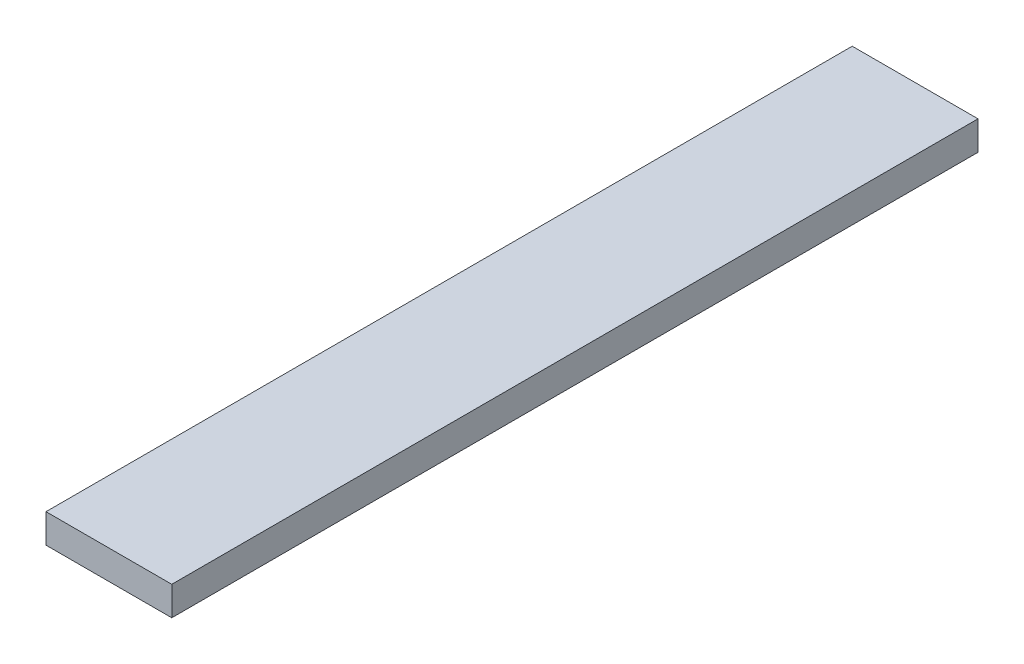
ISO-10303-21;
HEADER;
FILE_DESCRIPTION(('STEP AP214'),'2;1');
FILE_NAME('part.step','',(''),(''),'','','');
FILE_SCHEMA(('AUTOMOTIVE_DESIGN { 1 0 10303 214 1 1 1 1 }'));
ENDSEC;
DATA;
#1=APPLICATION_CONTEXT('core data for automotive mechanical design processes');
#2=APPLICATION_PROTOCOL_DEFINITION('international standard','automotive_design',2000,#1);
#3=PRODUCT_CONTEXT('',#1,'mechanical');
#4=PRODUCT('Part','Part','',(#3));
#5=PRODUCT_RELATED_PRODUCT_CATEGORY('part','',(#4));
#6=PRODUCT_DEFINITION_FORMATION('','',#4);
#7=PRODUCT_DEFINITION_CONTEXT('part definition',#1,'design');
#8=PRODUCT_DEFINITION('design','',#6,#7);
#9=PRODUCT_DEFINITION_SHAPE('','',#8);
#10=(LENGTH_UNIT() NAMED_UNIT(*) SI_UNIT(.MILLI.,.METRE.));
#11=(NAMED_UNIT(*) PLANE_ANGLE_UNIT() SI_UNIT($,.RADIAN.));
#12=(NAMED_UNIT(*) SI_UNIT($,.STERADIAN.) SOLID_ANGLE_UNIT());
#13=UNCERTAINTY_MEASURE_WITH_UNIT(LENGTH_MEASURE(1.E-05),#10,'distance_accuracy_value','');
#14=(GEOMETRIC_REPRESENTATION_CONTEXT(3) GLOBAL_UNCERTAINTY_ASSIGNED_CONTEXT((#13)) GLOBAL_UNIT_ASSIGNED_CONTEXT((#10,
#11,#12)) REPRESENTATION_CONTEXT('',''));
#15=CARTESIAN_POINT('',(0.,0.,0.));
#16=DIRECTION('',(0.,0.,1.));
#17=DIRECTION('',(1.,0.,0.));
#18=AXIS2_PLACEMENT_3D('',#15,#16,#17);
#19=CARTESIAN_POINT('',(0.,0.,500.));
#20=DIRECTION('',(1.,0.,0.));
#21=DIRECTION('',(0.,0.,-1.));
#22=AXIS2_PLACEMENT_3D('',#19,#20,#21);
#23=PLANE('',#22);
#24=DIRECTION('',(0.,-1.,0.));
#25=VECTOR('',#24,1.);
#26=CARTESIAN_POINT('',(0.,0.,0.));
#27=LINE('',#26,#25);
#28=CARTESIAN_POINT('',(0.,18.,0.));
#29=VERTEX_POINT('',#28);
#30=CARTESIAN_POINT('',(0.,0.,0.));
#31=VERTEX_POINT('',#30);
#32=EDGE_CURVE('E96',#29,#31,#27,.T.);
#33=ORIENTED_EDGE('',*,*,#32,.T.);
#34=DIRECTION('',(0.,0.,-1.));
#35=VECTOR('',#34,1.);
#36=CARTESIAN_POINT('',(0.,0.,500.));
#37=LINE('',#36,#35);
#38=CARTESIAN_POINT('',(0.,0.,500.));
#39=VERTEX_POINT('',#38);
#40=EDGE_CURVE('E11',#39,#31,#37,.T.);
#41=ORIENTED_EDGE('',*,*,#40,.F.);
#42=DIRECTION('',(0.,-1.,0.));
#43=VECTOR('',#42,1.);
#44=CARTESIAN_POINT('',(0.,0.,500.));
#45=LINE('',#44,#43);
#46=CARTESIAN_POINT('',(0.,18.,500.));
#47=VERTEX_POINT('',#46);
#48=EDGE_CURVE('E84',#47,#39,#45,.T.);
#49=ORIENTED_EDGE('',*,*,#48,.F.);
#50=DIRECTION('',(0.,0.,-1.));
#51=VECTOR('',#50,1.);
#52=CARTESIAN_POINT('',(0.,18.,500.));
#53=LINE('',#52,#51);
#54=EDGE_CURVE('E92',#47,#29,#53,.T.);
#55=ORIENTED_EDGE('',*,*,#54,.T.);
#56=EDGE_LOOP('',(#33,#41,#49,#55));
#57=FACE_BOUND('',#56,.T.);
#58=ADVANCED_FACE('F33',(#57),#23,.F.);
#59=CARTESIAN_POINT('',(0.,0.,500.));
#60=DIRECTION('',(0.,1.,0.));
#61=DIRECTION('',(0.,0.,1.));
#62=AXIS2_PLACEMENT_3D('',#59,#60,#61);
#63=PLANE('',#62);
#64=DIRECTION('',(1.,0.,0.));
#65=VECTOR('',#64,1.);
#66=CARTESIAN_POINT('',(0.,0.,0.));
#67=LINE('',#66,#65);
#68=CARTESIAN_POINT('',(78.,0.,0.));
#69=VERTEX_POINT('',#68);
#70=EDGE_CURVE('E88',#31,#69,#67,.T.);
#71=ORIENTED_EDGE('',*,*,#70,.T.);
#72=DIRECTION('',(0.,0.,-1.));
#73=VECTOR('',#72,1.);
#74=CARTESIAN_POINT('',(78.,0.,500.));
#75=LINE('',#74,#73);
#76=CARTESIAN_POINT('',(78.,0.,500.));
#77=VERTEX_POINT('',#76);
#78=EDGE_CURVE('E41',#77,#69,#75,.T.);
#79=ORIENTED_EDGE('',*,*,#78,.F.);
#80=DIRECTION('',(1.,0.,0.));
#81=VECTOR('',#80,1.);
#82=CARTESIAN_POINT('',(0.,0.,500.));
#83=LINE('',#82,#81);
#84=EDGE_CURVE('E79',#39,#77,#83,.T.);
#85=ORIENTED_EDGE('',*,*,#84,.F.);
#86=ORIENTED_EDGE('',*,*,#40,.T.);
#87=EDGE_LOOP('',(#71,#79,#85,#86));
#88=FACE_BOUND('',#87,.T.);
#89=ADVANCED_FACE('F87',(#88),#63,.F.);
#90=CARTESIAN_POINT('',(78.,0.,500.));
#91=DIRECTION('',(-1.,0.,0.));
#92=DIRECTION('',(0.,0.,1.));
#93=AXIS2_PLACEMENT_3D('',#90,#91,#92);
#94=PLANE('',#93);
#95=DIRECTION('',(0.,1.,0.));
#96=VECTOR('',#95,1.);
#97=CARTESIAN_POINT('',(78.,0.,0.));
#98=LINE('',#97,#96);
#99=CARTESIAN_POINT('',(78.,18.,0.));
#100=VERTEX_POINT('',#99);
#101=EDGE_CURVE('E66',#69,#100,#98,.T.);
#102=ORIENTED_EDGE('',*,*,#101,.T.);
#103=DIRECTION('',(0.,0.,-1.));
#104=VECTOR('',#103,1.);
#105=CARTESIAN_POINT('',(78.,18.,500.));
#106=LINE('',#105,#104);
#107=CARTESIAN_POINT('',(78.,18.,500.));
#108=VERTEX_POINT('',#107);
#109=EDGE_CURVE('E89',#108,#100,#106,.T.);
#110=ORIENTED_EDGE('',*,*,#109,.F.);
#111=DIRECTION('',(0.,1.,0.));
#112=VECTOR('',#111,1.);
#113=CARTESIAN_POINT('',(78.,0.,500.));
#114=LINE('',#113,#112);
#115=EDGE_CURVE('E82',#77,#108,#114,.T.);
#116=ORIENTED_EDGE('',*,*,#115,.F.);
#117=ORIENTED_EDGE('',*,*,#78,.T.);
#118=EDGE_LOOP('',(#102,#110,#116,#117));
#119=FACE_BOUND('',#118,.T.);
#120=ADVANCED_FACE('F90',(#119),#94,.F.);
#121=CARTESIAN_POINT('',(0.,18.,500.));
#122=DIRECTION('',(0.,-1.,0.));
#123=DIRECTION('',(0.,0.,-1.));
#124=AXIS2_PLACEMENT_3D('',#121,#122,#123);
#125=PLANE('',#124);
#126=DIRECTION('',(-1.,0.,0.));
#127=VECTOR('',#126,1.);
#128=CARTESIAN_POINT('',(0.,18.,0.));
#129=LINE('',#128,#127);
#130=EDGE_CURVE('E72',#100,#29,#129,.T.);
#131=ORIENTED_EDGE('',*,*,#130,.T.);
#132=ORIENTED_EDGE('',*,*,#54,.F.);
#133=DIRECTION('',(-1.,0.,0.));
#134=VECTOR('',#133,1.);
#135=CARTESIAN_POINT('',(0.,18.,500.));
#136=LINE('',#135,#134);
#137=EDGE_CURVE('E49',#108,#47,#136,.T.);
#138=ORIENTED_EDGE('',*,*,#137,.F.);
#139=ORIENTED_EDGE('',*,*,#109,.T.);
#140=EDGE_LOOP('',(#131,#132,#138,#139));
#141=FACE_BOUND('',#140,.T.);
#142=ADVANCED_FACE('F103',(#141),#125,.F.);
#143=CARTESIAN_POINT('',(0.,0.,500.));
#144=DIRECTION('',(0.,0.,-1.));
#145=DIRECTION('',(-1.,0.,0.));
#146=AXIS2_PLACEMENT_3D('',#143,#144,#145);
#147=PLANE('',#146);
#148=ORIENTED_EDGE('',*,*,#48,.T.);
#149=ORIENTED_EDGE('',*,*,#84,.T.);
#150=ORIENTED_EDGE('',*,*,#115,.T.);
#151=ORIENTED_EDGE('',*,*,#137,.T.);
#152=EDGE_LOOP('',(#148,#149,#150,#151));
#153=FACE_BOUND('',#152,.T.);
#154=ADVANCED_FACE('F80',(#153),#147,.F.);
#155=CARTESIAN_POINT('',(0.,0.,0.));
#156=DIRECTION('',(0.,0.,-1.));
#157=DIRECTION('',(-1.,0.,0.));
#158=AXIS2_PLACEMENT_3D('',#155,#156,#157);
#159=PLANE('',#158);
#160=ORIENTED_EDGE('',*,*,#32,.F.);
#161=ORIENTED_EDGE('',*,*,#130,.F.);
#162=ORIENTED_EDGE('',*,*,#101,.F.);
#163=ORIENTED_EDGE('',*,*,#70,.F.);
#164=EDGE_LOOP('',(#160,#161,#162,#163));
#165=FACE_BOUND('',#164,.T.);
#166=ADVANCED_FACE('F106',(#165),#159,.T.);
#167=CLOSED_SHELL('',(#58,#89,#120,#142,#154,#166));
#168=MANIFOLD_SOLID_BREP('B2',#167);
#169=ADVANCED_BREP_SHAPE_REPRESENTATION('',(#18,#168),#14);
#170=SHAPE_DEFINITION_REPRESENTATION(#9,#169);
ENDSEC;
END-ISO-10303-21;
